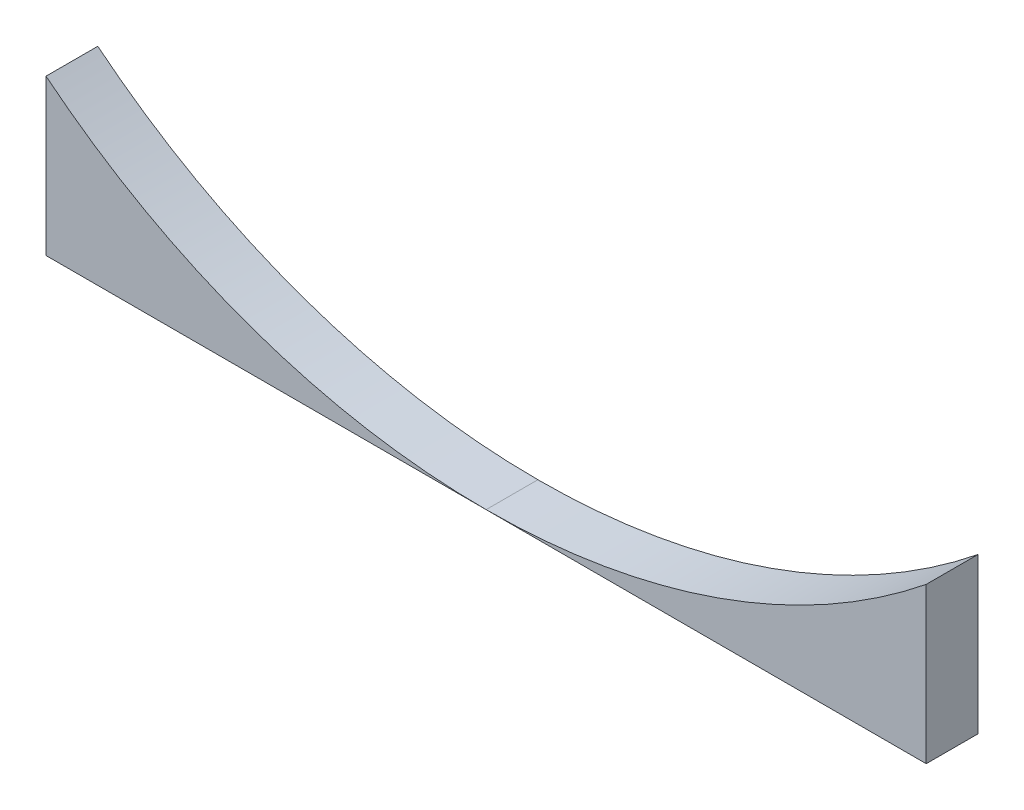
ISO-10303-21;
HEADER;
FILE_DESCRIPTION(('STEP AP214'),'2;1');
FILE_NAME('part.step','',(''),(''),'','','');
FILE_SCHEMA(('AUTOMOTIVE_DESIGN { 1 0 10303 214 1 1 1 1 }'));
ENDSEC;
DATA;
#1=APPLICATION_CONTEXT('core data for automotive mechanical design processes');
#2=APPLICATION_PROTOCOL_DEFINITION('international standard','automotive_design',2000,#1);
#3=PRODUCT_CONTEXT('',#1,'mechanical');
#4=PRODUCT('Part','Part','',(#3));
#5=PRODUCT_RELATED_PRODUCT_CATEGORY('part','',(#4));
#6=PRODUCT_DEFINITION_FORMATION('','',#4);
#7=PRODUCT_DEFINITION_CONTEXT('part definition',#1,'design');
#8=PRODUCT_DEFINITION('design','',#6,#7);
#9=PRODUCT_DEFINITION_SHAPE('','',#8);
#10=(LENGTH_UNIT() NAMED_UNIT(*) SI_UNIT(.MILLI.,.METRE.));
#11=(NAMED_UNIT(*) PLANE_ANGLE_UNIT() SI_UNIT($,.RADIAN.));
#12=(NAMED_UNIT(*) SI_UNIT($,.STERADIAN.) SOLID_ANGLE_UNIT());
#13=UNCERTAINTY_MEASURE_WITH_UNIT(LENGTH_MEASURE(1.E-05),#10,'distance_accuracy_value','');
#14=(GEOMETRIC_REPRESENTATION_CONTEXT(3) GLOBAL_UNCERTAINTY_ASSIGNED_CONTEXT((#13)) GLOBAL_UNIT_ASSIGNED_CONTEXT((#10,
#11,#12)) REPRESENTATION_CONTEXT('',''));
#15=CARTESIAN_POINT('',(0.,0.,0.));
#16=DIRECTION('',(0.,0.,1.));
#17=DIRECTION('',(1.,0.,0.));
#18=AXIS2_PLACEMENT_3D('',#15,#16,#17);
#19=CARTESIAN_POINT('',(0.,380.97779321868,20.));
#20=DIRECTION('',(0.,0.,-1.));
#21=DIRECTION('',(-1.,0.,0.));
#22=AXIS2_PLACEMENT_3D('',#19,#20,#21);
#23=CYLINDRICAL_SURFACE('',#22,270.833333333333);
#24=CARTESIAN_POINT('',(0.,380.97779321868,0.));
#25=DIRECTION('',(0.,0.,1.));
#26=DIRECTION('',(1.,0.,0.));
#27=AXIS2_PLACEMENT_3D('',#24,#25,#26);
#28=CIRCLE('',#27,270.833333333333);
#29=CARTESIAN_POINT('',(0.,110.144459885347,0.));
#30=VERTEX_POINT('',#29);
#31=CARTESIAN_POINT('',(170.,170.144459885347,0.));
#32=VERTEX_POINT('',#31);
#33=EDGE_CURVE('E94',#30,#32,#28,.T.);
#34=ORIENTED_EDGE('',*,*,#33,.F.);
#35=DIRECTION('',(0.,0.,-1.));
#36=VECTOR('',#35,1.);
#37=CARTESIAN_POINT('',(0.,110.144459885347,20.));
#38=LINE('',#37,#36);
#39=CARTESIAN_POINT('',(0.,110.144459885347,20.));
#40=VERTEX_POINT('',#39);
#41=EDGE_CURVE('E12',#40,#30,#38,.T.);
#42=ORIENTED_EDGE('',*,*,#41,.F.);
#43=CARTESIAN_POINT('',(0.,380.97779321868,20.));
#44=DIRECTION('',(0.,0.,1.));
#45=DIRECTION('',(1.,0.,0.));
#46=AXIS2_PLACEMENT_3D('',#43,#44,#45);
#47=CIRCLE('',#46,270.833333333333);
#48=CARTESIAN_POINT('',(170.,170.144459885347,20.));
#49=VERTEX_POINT('',#48);
#50=EDGE_CURVE('E92',#40,#49,#47,.T.);
#51=ORIENTED_EDGE('',*,*,#50,.T.);
#52=DIRECTION('',(0.,0.,-1.));
#53=VECTOR('',#52,1.);
#54=CARTESIAN_POINT('',(170.,170.144459885347,20.));
#55=LINE('',#54,#53);
#56=EDGE_CURVE('E74',#49,#32,#55,.T.);
#57=ORIENTED_EDGE('',*,*,#56,.T.);
#58=EDGE_LOOP('',(#34,#42,#51,#57));
#59=FACE_BOUND('',#58,.T.);
#60=ADVANCED_FACE('F57',(#59),#23,.F.);
#61=CARTESIAN_POINT('',(0.,110.144459885347,20.));
#62=DIRECTION('',(0.,1.,0.));
#63=DIRECTION('',(0.,0.,1.));
#64=AXIS2_PLACEMENT_3D('',#61,#62,#63);
#65=PLANE('',#64);
#66=DIRECTION('',(1.,0.,0.));
#67=VECTOR('',#66,1.);
#68=CARTESIAN_POINT('',(0.,110.144459885347,0.));
#69=LINE('',#68,#67);
#70=CARTESIAN_POINT('',(170.,110.144459885347,0.));
#71=VERTEX_POINT('',#70);
#72=EDGE_CURVE('E109',#30,#71,#69,.T.);
#73=ORIENTED_EDGE('',*,*,#72,.T.);
#74=DIRECTION('',(0.,0.,-1.));
#75=VECTOR('',#74,1.);
#76=CARTESIAN_POINT('',(170.,110.144459885347,20.));
#77=LINE('',#76,#75);
#78=CARTESIAN_POINT('',(170.,110.144459885347,20.));
#79=VERTEX_POINT('',#78);
#80=EDGE_CURVE('E66',#79,#71,#77,.T.);
#81=ORIENTED_EDGE('',*,*,#80,.F.);
#82=DIRECTION('',(1.,0.,0.));
#83=VECTOR('',#82,1.);
#84=CARTESIAN_POINT('',(0.,110.144459885347,20.));
#85=LINE('',#84,#83);
#86=EDGE_CURVE('E97',#40,#79,#85,.T.);
#87=ORIENTED_EDGE('',*,*,#86,.F.);
#88=ORIENTED_EDGE('',*,*,#41,.T.);
#89=EDGE_LOOP('',(#73,#81,#87,#88));
#90=FACE_BOUND('',#89,.T.);
#91=ADVANCED_FACE('F98',(#90),#65,.F.);
#92=CARTESIAN_POINT('',(170.,0.,20.));
#93=DIRECTION('',(1.,0.,0.));
#94=DIRECTION('',(0.,1.,0.));
#95=AXIS2_PLACEMENT_3D('',#92,#93,#94);
#96=PLANE('',#95);
#97=DIRECTION('',(0.,-1.,0.));
#98=VECTOR('',#97,1.);
#99=CARTESIAN_POINT('',(170.,0.,0.));
#100=LINE('',#99,#98);
#101=EDGE_CURVE('E105',#32,#71,#100,.T.);
#102=ORIENTED_EDGE('',*,*,#101,.F.);
#103=ORIENTED_EDGE('',*,*,#56,.F.);
#104=DIRECTION('',(0.,-1.,0.));
#105=VECTOR('',#104,1.);
#106=CARTESIAN_POINT('',(170.,0.,20.));
#107=LINE('',#106,#105);
#108=EDGE_CURVE('E101',#49,#79,#107,.T.);
#109=ORIENTED_EDGE('',*,*,#108,.T.);
#110=ORIENTED_EDGE('',*,*,#80,.T.);
#111=EDGE_LOOP('',(#102,#103,#109,#110));
#112=FACE_BOUND('',#111,.T.);
#113=ADVANCED_FACE('F122',(#112),#96,.T.);
#114=CARTESIAN_POINT('',(0.,0.,20.));
#115=DIRECTION('',(0.,0.,1.));
#116=DIRECTION('',(1.,0.,0.));
#117=AXIS2_PLACEMENT_3D('',#114,#115,#116);
#118=PLANE('',#117);
#119=ORIENTED_EDGE('',*,*,#50,.F.);
#120=ORIENTED_EDGE('',*,*,#86,.T.);
#121=ORIENTED_EDGE('',*,*,#108,.F.);
#122=EDGE_LOOP('',(#119,#120,#121));
#123=FACE_BOUND('',#122,.T.);
#124=ADVANCED_FACE('F103',(#123),#118,.T.);
#125=CARTESIAN_POINT('',(0.,0.,0.));
#126=DIRECTION('',(0.,0.,1.));
#127=DIRECTION('',(1.,0.,0.));
#128=AXIS2_PLACEMENT_3D('',#125,#126,#127);
#129=PLANE('',#128);
#130=ORIENTED_EDGE('',*,*,#33,.T.);
#131=ORIENTED_EDGE('',*,*,#101,.T.);
#132=ORIENTED_EDGE('',*,*,#72,.F.);
#133=EDGE_LOOP('',(#130,#131,#132));
#134=FACE_BOUND('',#133,.T.);
#135=ADVANCED_FACE('F121',(#134),#129,.F.);
#136=CLOSED_SHELL('',(#60,#91,#113,#124,#135));
#137=MANIFOLD_SOLID_BREP('B2',#136);
#138=CARTESIAN_POINT('',(0.,380.97779321868,20.));
#139=DIRECTION('',(0.,0.,-1.));
#140=DIRECTION('',(-1.,0.,0.));
#141=AXIS2_PLACEMENT_3D('',#138,#139,#140);
#142=CYLINDRICAL_SURFACE('',#141,270.833333333333);
#143=CARTESIAN_POINT('',(0.,380.97779321868,0.));
#144=DIRECTION('',(0.,0.,1.));
#145=DIRECTION('',(1.,0.,0.));
#146=AXIS2_PLACEMENT_3D('',#143,#144,#145);
#147=CIRCLE('',#146,270.833333333333);
#148=CARTESIAN_POINT('',(-170.,170.144459885347,0.));
#149=VERTEX_POINT('',#148);
#150=CARTESIAN_POINT('',(0.,110.144459885347,0.));
#151=VERTEX_POINT('',#150);
#152=EDGE_CURVE('E204',#149,#151,#147,.T.);
#153=ORIENTED_EDGE('',*,*,#152,.F.);
#154=DIRECTION('',(0.,0.,-1.));
#155=VECTOR('',#154,1.);
#156=CARTESIAN_POINT('',(-170.,170.144459885347,20.));
#157=LINE('',#156,#155);
#158=CARTESIAN_POINT('',(-170.,170.144459885347,20.));
#159=VERTEX_POINT('',#158);
#160=EDGE_CURVE('E55',#159,#149,#157,.T.);
#161=ORIENTED_EDGE('',*,*,#160,.F.);
#162=CARTESIAN_POINT('',(0.,380.97779321868,20.));
#163=DIRECTION('',(0.,0.,1.));
#164=DIRECTION('',(1.,0.,0.));
#165=AXIS2_PLACEMENT_3D('',#162,#163,#164);
#166=CIRCLE('',#165,270.833333333333);
#167=CARTESIAN_POINT('',(0.,110.144459885347,20.));
#168=VERTEX_POINT('',#167);
#169=EDGE_CURVE('E202',#159,#168,#166,.T.);
#170=ORIENTED_EDGE('',*,*,#169,.T.);
#171=DIRECTION('',(0.,0.,-1.));
#172=VECTOR('',#171,1.);
#173=CARTESIAN_POINT('',(0.,110.144459885347,20.));
#174=LINE('',#173,#172);
#175=EDGE_CURVE('E198',#168,#151,#174,.T.);
#176=ORIENTED_EDGE('',*,*,#175,.T.);
#177=EDGE_LOOP('',(#153,#161,#170,#176));
#178=FACE_BOUND('',#177,.T.);
#179=ADVANCED_FACE('F164',(#178),#142,.F.);
#180=CARTESIAN_POINT('',(-170.,0.,20.));
#181=DIRECTION('',(1.,0.,0.));
#182=DIRECTION('',(0.,1.,0.));
#183=AXIS2_PLACEMENT_3D('',#180,#181,#182);
#184=PLANE('',#183);
#185=DIRECTION('',(0.,-1.,0.));
#186=VECTOR('',#185,1.);
#187=CARTESIAN_POINT('',(-170.,0.,0.));
#188=LINE('',#187,#186);
#189=CARTESIAN_POINT('',(-170.,110.144459885347,0.));
#190=VERTEX_POINT('',#189);
#191=EDGE_CURVE('E192',#149,#190,#188,.T.);
#192=ORIENTED_EDGE('',*,*,#191,.T.);
#193=DIRECTION('',(0.,0.,-1.));
#194=VECTOR('',#193,1.);
#195=CARTESIAN_POINT('',(-170.,110.144459885347,20.));
#196=LINE('',#195,#194);
#197=CARTESIAN_POINT('',(-170.,110.144459885347,20.));
#198=VERTEX_POINT('',#197);
#199=EDGE_CURVE('E172',#198,#190,#196,.T.);
#200=ORIENTED_EDGE('',*,*,#199,.F.);
#201=DIRECTION('',(0.,-1.,0.));
#202=VECTOR('',#201,1.);
#203=CARTESIAN_POINT('',(-170.,0.,20.));
#204=LINE('',#203,#202);
#205=EDGE_CURVE('E205',#159,#198,#204,.T.);
#206=ORIENTED_EDGE('',*,*,#205,.F.);
#207=ORIENTED_EDGE('',*,*,#160,.T.);
#208=EDGE_LOOP('',(#192,#200,#206,#207));
#209=FACE_BOUND('',#208,.T.);
#210=ADVANCED_FACE('F206',(#209),#184,.F.);
#211=CARTESIAN_POINT('',(0.,110.144459885347,20.));
#212=DIRECTION('',(0.,1.,0.));
#213=DIRECTION('',(0.,0.,1.));
#214=AXIS2_PLACEMENT_3D('',#211,#212,#213);
#215=PLANE('',#214);
#216=DIRECTION('',(1.,0.,0.));
#217=VECTOR('',#216,1.);
#218=CARTESIAN_POINT('',(0.,110.144459885347,0.));
#219=LINE('',#218,#217);
#220=EDGE_CURVE('E209',#190,#151,#219,.T.);
#221=ORIENTED_EDGE('',*,*,#220,.T.);
#222=ORIENTED_EDGE('',*,*,#175,.F.);
#223=DIRECTION('',(1.,0.,0.));
#224=VECTOR('',#223,1.);
#225=CARTESIAN_POINT('',(0.,110.144459885347,20.));
#226=LINE('',#225,#224);
#227=EDGE_CURVE('E180',#198,#168,#226,.T.);
#228=ORIENTED_EDGE('',*,*,#227,.F.);
#229=ORIENTED_EDGE('',*,*,#199,.T.);
#230=EDGE_LOOP('',(#221,#222,#228,#229));
#231=FACE_BOUND('',#230,.T.);
#232=ADVANCED_FACE('F218',(#231),#215,.F.);
#233=CARTESIAN_POINT('',(0.,0.,20.));
#234=DIRECTION('',(0.,0.,1.));
#235=DIRECTION('',(1.,0.,0.));
#236=AXIS2_PLACEMENT_3D('',#233,#234,#235);
#237=PLANE('',#236);
#238=ORIENTED_EDGE('',*,*,#169,.F.);
#239=ORIENTED_EDGE('',*,*,#205,.T.);
#240=ORIENTED_EDGE('',*,*,#227,.T.);
#241=EDGE_LOOP('',(#238,#239,#240));
#242=FACE_BOUND('',#241,.T.);
#243=ADVANCED_FACE('F208',(#242),#237,.T.);
#244=CARTESIAN_POINT('',(0.,0.,0.));
#245=DIRECTION('',(0.,0.,1.));
#246=DIRECTION('',(1.,0.,0.));
#247=AXIS2_PLACEMENT_3D('',#244,#245,#246);
#248=PLANE('',#247);
#249=ORIENTED_EDGE('',*,*,#152,.T.);
#250=ORIENTED_EDGE('',*,*,#220,.F.);
#251=ORIENTED_EDGE('',*,*,#191,.F.);
#252=EDGE_LOOP('',(#249,#250,#251));
#253=FACE_BOUND('',#252,.T.);
#254=ADVANCED_FACE('F220',(#253),#248,.F.);
#255=CLOSED_SHELL('',(#179,#210,#232,#243,#254));
#256=MANIFOLD_SOLID_BREP('B6',#255);
#257=ADVANCED_BREP_SHAPE_REPRESENTATION('',(#18,#137,#256),#14);
#258=SHAPE_DEFINITION_REPRESENTATION(#9,#257);
ENDSEC;
END-ISO-10303-21;
